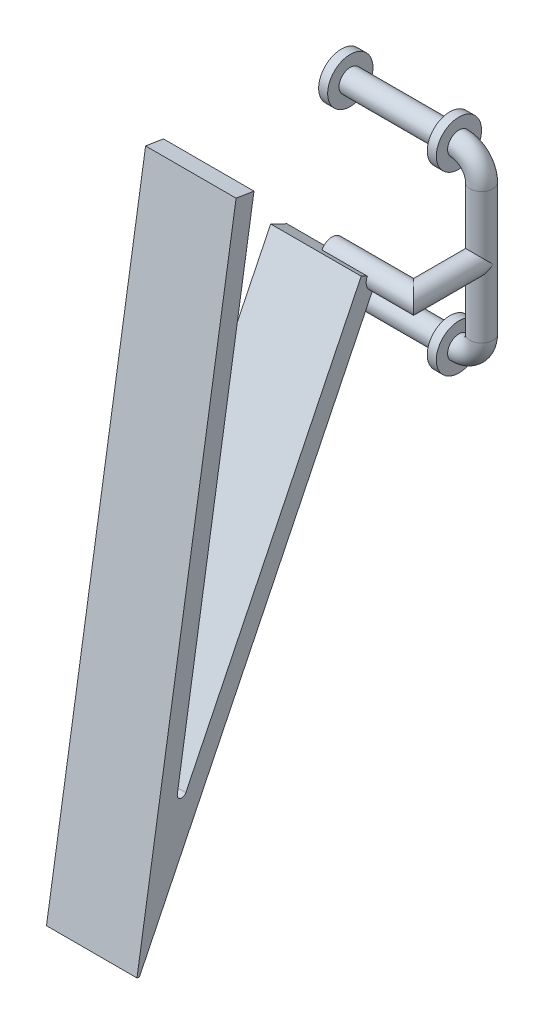
ISO-10303-21;
HEADER;
FILE_DESCRIPTION(('STEP AP214'),'2;1');
FILE_NAME('part.step','',(''),(''),'','','');
FILE_SCHEMA(('AUTOMOTIVE_DESIGN { 1 0 10303 214 1 1 1 1 }'));
ENDSEC;
DATA;
#1=APPLICATION_CONTEXT('core data for automotive mechanical design processes');
#2=APPLICATION_PROTOCOL_DEFINITION('international standard','automotive_design',2000,#1);
#3=PRODUCT_CONTEXT('',#1,'mechanical');
#4=PRODUCT('Part','Part','',(#3));
#5=PRODUCT_RELATED_PRODUCT_CATEGORY('part','',(#4));
#6=PRODUCT_DEFINITION_FORMATION('','',#4);
#7=PRODUCT_DEFINITION_CONTEXT('part definition',#1,'design');
#8=PRODUCT_DEFINITION('design','',#6,#7);
#9=PRODUCT_DEFINITION_SHAPE('','',#8);
#10=(LENGTH_UNIT() NAMED_UNIT(*) SI_UNIT(.MILLI.,.METRE.));
#11=(NAMED_UNIT(*) PLANE_ANGLE_UNIT() SI_UNIT($,.RADIAN.));
#12=(NAMED_UNIT(*) SI_UNIT($,.STERADIAN.) SOLID_ANGLE_UNIT());
#13=UNCERTAINTY_MEASURE_WITH_UNIT(LENGTH_MEASURE(1.E-05),#10,'distance_accuracy_value','');
#14=(GEOMETRIC_REPRESENTATION_CONTEXT(3) GLOBAL_UNCERTAINTY_ASSIGNED_CONTEXT((#13)) GLOBAL_UNIT_ASSIGNED_CONTEXT((#10,
#11,#12)) REPRESENTATION_CONTEXT('',''));
#15=CARTESIAN_POINT('',(0.,0.,0.));
#16=DIRECTION('',(0.,0.,1.));
#17=DIRECTION('',(1.,0.,0.));
#18=AXIS2_PLACEMENT_3D('',#15,#16,#17);
#19=CARTESIAN_POINT('',(31.,5.,0.));
#20=DIRECTION('',(0.,1.,0.));
#21=DIRECTION('',(-1.,0.,0.));
#22=AXIS2_PLACEMENT_3D('',#19,#20,#21);
#23=CYLINDRICAL_SURFACE('',#22,2.5);
#24=CARTESIAN_POINT('',(31.,34.,0.));
#25=DIRECTION('',(0.,1.,0.));
#26=DIRECTION('',(0.,0.,-1.));
#27=AXIS2_PLACEMENT_3D('',#24,#25,#26);
#28=CIRCLE('',#27,2.5);
#29=CARTESIAN_POINT('',(33.5,34.,0.));
#30=VERTEX_POINT('',#29);
#31=EDGE_CURVE('E232',#30,#30,#28,.T.);
#32=ORIENTED_EDGE('',*,*,#31,.F.);
#33=EDGE_LOOP('',(#32));
#34=FACE_BOUND('',#33,.T.);
#35=CARTESIAN_POINT('',(31.,5.,0.));
#36=DIRECTION('',(0.,1.,0.));
#37=DIRECTION('',(0.,0.,-1.));
#38=AXIS2_PLACEMENT_3D('',#35,#36,#37);
#39=CIRCLE('',#38,2.5);
#40=CARTESIAN_POINT('',(33.5,5.,0.));
#41=VERTEX_POINT('',#40);
#42=EDGE_CURVE('E229',#41,#41,#39,.T.);
#43=ORIENTED_EDGE('',*,*,#42,.T.);
#44=EDGE_LOOP('',(#43));
#45=FACE_BOUND('',#44,.T.);
#46=CARTESIAN_POINT('',(31.,19.5799362712137,0.));
#47=DIRECTION('',(0.,0.707106781186547,0.707106781186548));
#48=DIRECTION('',(0.,0.707106781186547,-0.707106781186548));
#49=AXIS2_PLACEMENT_3D('',#46,#47,#48);
#50=ELLIPSE('',#49,3.53553390593274,2.5);
#51=CARTESIAN_POINT('',(33.5,19.5799362712137,0.));
#52=VERTEX_POINT('',#51);
#53=CARTESIAN_POINT('',(28.5,19.5799362712137,0.));
#54=VERTEX_POINT('',#53);
#55=EDGE_CURVE('E246',#52,#54,#50,.F.);
#56=ORIENTED_EDGE('',*,*,#55,.T.);
#57=CARTESIAN_POINT('',(31.,19.5799362712137,0.));
#58=DIRECTION('',(0.,0.707106781186547,-0.707106781186548));
#59=DIRECTION('',(0.,0.707106781186547,0.707106781186548));
#60=AXIS2_PLACEMENT_3D('',#57,#58,#59);
#61=ELLIPSE('',#60,3.53553390593274,2.5);
#62=EDGE_CURVE('E56',#54,#52,#61,.T.);
#63=ORIENTED_EDGE('',*,*,#62,.T.);
#64=EDGE_LOOP('',(#56,#63));
#65=FACE_BOUND('',#64,.T.);
#66=ADVANCED_FACE('F34',(#34,#45,#65),#23,.T.);
#67=CARTESIAN_POINT('',(26.,34.,0.));
#68=DIRECTION('',(0.,0.,1.));
#69=DIRECTION('',(1.,0.,0.));
#70=AXIS2_PLACEMENT_3D('',#67,#68,#69);
#71=TOROIDAL_SURFACE('',#70,4.99999999999999,2.5);
#72=CARTESIAN_POINT('',(26.,39.,0.));
#73=DIRECTION('',(-1.,0.,0.));
#74=DIRECTION('',(0.,0.,-1.));
#75=AXIS2_PLACEMENT_3D('',#72,#73,#74);
#76=CIRCLE('',#75,2.5);
#77=CARTESIAN_POINT('',(26.,41.5,0.));
#78=VERTEX_POINT('',#77);
#79=EDGE_CURVE('E235',#78,#78,#76,.T.);
#80=CARTESIAN_POINT('',(26.,34.,0.));
#81=DIRECTION('',(0.,0.,1.));
#82=DIRECTION('',(1.,0.,0.));
#83=AXIS2_PLACEMENT_3D('',#80,#81,#82);
#84=CIRCLE('',#83,7.49999999999999);
#85=EDGE_CURVE('',#30,#78,#84,.T.);
#86=ORIENTED_EDGE('',*,*,#31,.T.);
#87=ORIENTED_EDGE('',*,*,#79,.F.);
#88=ORIENTED_EDGE('',*,*,#85,.T.);
#89=ORIENTED_EDGE('',*,*,#85,.F.);
#90=EDGE_LOOP('',(#86,#88,#87,#89));
#91=FACE_BOUND('',#90,.T.);
#92=ADVANCED_FACE('F273',(#91),#71,.T.);
#93=CARTESIAN_POINT('',(26.,5.,0.));
#94=DIRECTION('',(0.,0.,1.));
#95=DIRECTION('',(1.,0.,0.));
#96=AXIS2_PLACEMENT_3D('',#93,#94,#95);
#97=TOROIDAL_SURFACE('',#96,5.,2.5);
#98=CARTESIAN_POINT('',(26.,0.,0.));
#99=DIRECTION('',(1.,0.,0.));
#100=DIRECTION('',(0.,0.,-1.));
#101=AXIS2_PLACEMENT_3D('',#98,#99,#100);
#102=CIRCLE('',#101,2.5);
#103=CARTESIAN_POINT('',(26.,-2.5,0.));
#104=VERTEX_POINT('',#103);
#105=EDGE_CURVE('E210',#104,#104,#102,.T.);
#106=CARTESIAN_POINT('',(26.,5.,0.));
#107=DIRECTION('',(0.,0.,1.));
#108=DIRECTION('',(1.,0.,0.));
#109=AXIS2_PLACEMENT_3D('',#106,#107,#108);
#110=CIRCLE('',#109,7.5);
#111=EDGE_CURVE('',#104,#41,#110,.T.);
#112=ORIENTED_EDGE('',*,*,#105,.T.);
#113=ORIENTED_EDGE('',*,*,#42,.F.);
#114=ORIENTED_EDGE('',*,*,#111,.T.);
#115=ORIENTED_EDGE('',*,*,#111,.F.);
#116=EDGE_LOOP('',(#112,#114,#113,#115));
#117=FACE_BOUND('',#116,.T.);
#118=ADVANCED_FACE('F281',(#117),#97,.T.);
#119=CARTESIAN_POINT('',(24.,0.,0.));
#120=DIRECTION('',(1.,0.,0.));
#121=DIRECTION('',(0.,0.,-1.));
#122=AXIS2_PLACEMENT_3D('',#119,#120,#121);
#123=PLANE('',#122);
#124=CARTESIAN_POINT('',(24.,0.,0.));
#125=DIRECTION('',(1.,0.,0.));
#126=DIRECTION('',(0.,0.,-1.));
#127=AXIS2_PLACEMENT_3D('',#124,#125,#126);
#128=CIRCLE('',#127,5.);
#129=CARTESIAN_POINT('',(24.,0.,-5.));
#130=VERTEX_POINT('',#129);
#131=EDGE_CURVE('E207',#130,#130,#128,.T.);
#132=ORIENTED_EDGE('',*,*,#131,.F.);
#133=EDGE_LOOP('',(#132));
#134=FACE_BOUND('',#133,.T.);
#135=CARTESIAN_POINT('',(24.,0.,0.));
#136=DIRECTION('',(1.,0.,0.));
#137=DIRECTION('',(0.,0.,-1.));
#138=AXIS2_PLACEMENT_3D('',#135,#136,#137);
#139=CIRCLE('',#138,2.5);
#140=CARTESIAN_POINT('',(24.,0.,2.5));
#141=VERTEX_POINT('',#140);
#142=EDGE_CURVE('E243',#141,#141,#139,.T.);
#143=ORIENTED_EDGE('',*,*,#142,.T.);
#144=EDGE_LOOP('',(#143));
#145=FACE_BOUND('',#144,.T.);
#146=ADVANCED_FACE('F288',(#134,#145),#123,.F.);
#147=CARTESIAN_POINT('',(26.,0.,0.));
#148=DIRECTION('',(1.,0.,0.));
#149=DIRECTION('',(0.,0.,-1.));
#150=AXIS2_PLACEMENT_3D('',#147,#148,#149);
#151=PLANE('',#150);
#152=CARTESIAN_POINT('',(26.,0.,0.));
#153=DIRECTION('',(1.,0.,0.));
#154=DIRECTION('',(0.,0.,-1.));
#155=AXIS2_PLACEMENT_3D('',#152,#153,#154);
#156=CIRCLE('',#155,5.);
#157=CARTESIAN_POINT('',(26.,0.,-5.));
#158=VERTEX_POINT('',#157);
#159=EDGE_CURVE('E211',#158,#158,#156,.T.);
#160=ORIENTED_EDGE('',*,*,#159,.T.);
#161=EDGE_LOOP('',(#160));
#162=FACE_BOUND('',#161,.T.);
#163=ORIENTED_EDGE('',*,*,#105,.F.);
#164=EDGE_LOOP('',(#163));
#165=FACE_BOUND('',#164,.T.);
#166=ADVANCED_FACE('F323',(#162,#165),#151,.T.);
#167=CARTESIAN_POINT('',(24.,0.,0.));
#168=DIRECTION('',(1.,0.,0.));
#169=DIRECTION('',(0.,0.,-1.));
#170=AXIS2_PLACEMENT_3D('',#167,#168,#169);
#171=CYLINDRICAL_SURFACE('',#170,5.);
#172=ORIENTED_EDGE('',*,*,#131,.T.);
#173=EDGE_LOOP('',(#172));
#174=FACE_BOUND('',#173,.T.);
#175=ORIENTED_EDGE('',*,*,#159,.F.);
#176=EDGE_LOOP('',(#175));
#177=FACE_BOUND('',#176,.T.);
#178=ADVANCED_FACE('F300',(#174,#177),#171,.T.);
#179=CARTESIAN_POINT('',(0.,0.,0.));
#180=DIRECTION('',(1.,0.,0.));
#181=DIRECTION('',(0.,0.,-1.));
#182=AXIS2_PLACEMENT_3D('',#179,#180,#181);
#183=PLANE('',#182);
#184=CARTESIAN_POINT('',(0.,0.,0.));
#185=DIRECTION('',(1.,0.,0.));
#186=DIRECTION('',(0.,0.,-1.));
#187=AXIS2_PLACEMENT_3D('',#184,#185,#186);
#188=CIRCLE('',#187,5.);
#189=CARTESIAN_POINT('',(0.,0.,-5.));
#190=VERTEX_POINT('',#189);
#191=EDGE_CURVE('E220',#190,#190,#188,.T.);
#192=ORIENTED_EDGE('',*,*,#191,.F.);
#193=EDGE_LOOP('',(#192));
#194=FACE_BOUND('',#193,.T.);
#195=ADVANCED_FACE('F296',(#194),#183,.F.);
#196=CARTESIAN_POINT('',(2.,0.,0.));
#197=DIRECTION('',(-1.,0.,0.));
#198=DIRECTION('',(0.,0.,1.));
#199=AXIS2_PLACEMENT_3D('',#196,#197,#198);
#200=CYLINDRICAL_SURFACE('',#199,5.);
#201=CARTESIAN_POINT('',(2.,0.,0.));
#202=DIRECTION('',(1.,0.,0.));
#203=DIRECTION('',(0.,0.,-1.));
#204=AXIS2_PLACEMENT_3D('',#201,#202,#203);
#205=CIRCLE('',#204,5.);
#206=CARTESIAN_POINT('',(2.,0.,-5.));
#207=VERTEX_POINT('',#206);
#208=EDGE_CURVE('E223',#207,#207,#205,.T.);
#209=ORIENTED_EDGE('',*,*,#208,.F.);
#210=EDGE_LOOP('',(#209));
#211=FACE_BOUND('',#210,.T.);
#212=ORIENTED_EDGE('',*,*,#191,.T.);
#213=EDGE_LOOP('',(#212));
#214=FACE_BOUND('',#213,.T.);
#215=ADVANCED_FACE('F299',(#211,#214),#200,.T.);
#216=CARTESIAN_POINT('',(2.,0.,0.));
#217=DIRECTION('',(1.,0.,0.));
#218=DIRECTION('',(0.,0.,-1.));
#219=AXIS2_PLACEMENT_3D('',#216,#217,#218);
#220=PLANE('',#219);
#221=ORIENTED_EDGE('',*,*,#208,.T.);
#222=EDGE_LOOP('',(#221));
#223=FACE_BOUND('',#222,.T.);
#224=CARTESIAN_POINT('',(2.,0.,0.));
#225=DIRECTION('',(1.,0.,0.));
#226=DIRECTION('',(0.,0.,-1.));
#227=AXIS2_PLACEMENT_3D('',#224,#225,#226);
#228=CIRCLE('',#227,2.5);
#229=CARTESIAN_POINT('',(1.99999999999999,0.,2.5));
#230=VERTEX_POINT('',#229);
#231=EDGE_CURVE('E226',#230,#230,#228,.T.);
#232=ORIENTED_EDGE('',*,*,#231,.F.);
#233=EDGE_LOOP('',(#232));
#234=FACE_BOUND('',#233,.T.);
#235=ADVANCED_FACE('F294',(#223,#234),#220,.T.);
#236=CARTESIAN_POINT('',(26.,0.,0.));
#237=DIRECTION('',(-1.,0.,0.));
#238=DIRECTION('',(0.,0.,1.));
#239=AXIS2_PLACEMENT_3D('',#236,#237,#238);
#240=CYLINDRICAL_SURFACE('',#239,2.5);
#241=CARTESIAN_POINT('',(1.99999999999999,0.,2.5));
#242=CARTESIAN_POINT('',(2.22916666666666,0.,2.5));
#243=CARTESIAN_POINT('',(2.45833333333333,0.,2.5));
#244=CARTESIAN_POINT('',(2.91666666666666,0.,2.5));
#245=CARTESIAN_POINT('',(3.14583333333333,0.,2.5));
#246=CARTESIAN_POINT('',(3.60416666666666,0.,2.5));
#247=CARTESIAN_POINT('',(3.83333333333333,0.,2.5));
#248=CARTESIAN_POINT('',(4.29166666666666,0.,2.5));
#249=CARTESIAN_POINT('',(4.52083333333333,0.,2.5));
#250=CARTESIAN_POINT('',(4.97916666666666,0.,2.5));
#251=CARTESIAN_POINT('',(5.20833333333333,0.,2.5));
#252=CARTESIAN_POINT('',(5.66666666666666,0.,2.5));
#253=CARTESIAN_POINT('',(5.89583333333333,0.,2.5));
#254=CARTESIAN_POINT('',(6.35416666666666,0.,2.5));
#255=CARTESIAN_POINT('',(6.58333333333333,0.,2.5));
#256=CARTESIAN_POINT('',(7.04166666666666,0.,2.5));
#257=CARTESIAN_POINT('',(7.27083333333333,0.,2.5));
#258=CARTESIAN_POINT('',(7.72916666666666,0.,2.5));
#259=CARTESIAN_POINT('',(7.95833333333333,0.,2.5));
#260=CARTESIAN_POINT('',(8.41666666666666,0.,2.5));
#261=CARTESIAN_POINT('',(8.64583333333333,0.,2.5));
#262=CARTESIAN_POINT('',(9.10416666666666,0.,2.5));
#263=CARTESIAN_POINT('',(9.33333333333333,0.,2.5));
#264=CARTESIAN_POINT('',(9.79166666666666,0.,2.5));
#265=CARTESIAN_POINT('',(10.0208333333333,0.,2.5));
#266=CARTESIAN_POINT('',(10.4791666666667,0.,2.5));
#267=CARTESIAN_POINT('',(10.7083333333333,0.,2.5));
#268=CARTESIAN_POINT('',(11.1666666666667,0.,2.5));
#269=CARTESIAN_POINT('',(11.3958333333333,0.,2.5));
#270=CARTESIAN_POINT('',(11.8541666666667,0.,2.5));
#271=CARTESIAN_POINT('',(12.0833333333333,0.,2.5));
#272=CARTESIAN_POINT('',(12.5416666666667,0.,2.5));
#273=CARTESIAN_POINT('',(12.7708333333333,0.,2.5));
#274=CARTESIAN_POINT('',(13.2291666666667,0.,2.5));
#275=CARTESIAN_POINT('',(13.4583333333333,0.,2.5));
#276=CARTESIAN_POINT('',(13.9166666666667,0.,2.5));
#277=CARTESIAN_POINT('',(14.1458333333333,0.,2.5));
#278=CARTESIAN_POINT('',(14.6041666666667,0.,2.5));
#279=CARTESIAN_POINT('',(14.8333333333333,0.,2.5));
#280=CARTESIAN_POINT('',(15.2916666666667,0.,2.5));
#281=CARTESIAN_POINT('',(15.5208333333333,0.,2.5));
#282=CARTESIAN_POINT('',(15.9791666666667,0.,2.5));
#283=CARTESIAN_POINT('',(16.2083333333333,0.,2.5));
#284=CARTESIAN_POINT('',(16.6666666666667,0.,2.5));
#285=CARTESIAN_POINT('',(16.8958333333333,0.,2.5));
#286=CARTESIAN_POINT('',(17.3541666666667,0.,2.5));
#287=CARTESIAN_POINT('',(17.5833333333333,0.,2.5));
#288=CARTESIAN_POINT('',(18.0416666666667,0.,2.5));
#289=CARTESIAN_POINT('',(18.2708333333333,0.,2.5));
#290=CARTESIAN_POINT('',(18.7291666666667,0.,2.5));
#291=CARTESIAN_POINT('',(18.9583333333333,0.,2.5));
#292=CARTESIAN_POINT('',(19.4166666666667,0.,2.5));
#293=CARTESIAN_POINT('',(19.6458333333333,0.,2.5));
#294=CARTESIAN_POINT('',(20.1041666666667,0.,2.5));
#295=CARTESIAN_POINT('',(20.3333333333333,0.,2.5));
#296=CARTESIAN_POINT('',(20.7916666666667,0.,2.5));
#297=CARTESIAN_POINT('',(21.0208333333333,0.,2.5));
#298=CARTESIAN_POINT('',(21.4791666666667,0.,2.5));
#299=CARTESIAN_POINT('',(21.7083333333333,0.,2.5));
#300=CARTESIAN_POINT('',(22.1666666666667,0.,2.5));
#301=CARTESIAN_POINT('',(22.3958333333333,0.,2.5));
#302=CARTESIAN_POINT('',(22.8541666666667,0.,2.5));
#303=CARTESIAN_POINT('',(23.0833333333333,0.,2.5));
#304=CARTESIAN_POINT('',(23.5416666666667,0.,2.5));
#305=CARTESIAN_POINT('',(23.7708333333333,0.,2.5));
#306=CARTESIAN_POINT('',(24.,0.,2.5));
#307=B_SPLINE_CURVE_WITH_KNOTS('',3,(#241,#242,#243,#244,#245,#246,#247,#248,#249,#250,#251,
#252,#253,#254,#255,#256,#257,#258,#259,#260,#261,#262,#263,#264,#265,#266,#267,#268,#269,#270,
#271,#272,#273,#274,#275,#276,#277,#278,#279,#280,#281,#282,#283,#284,#285,#286,#287,#288,#289,
#290,#291,#292,#293,#294,#295,#296,#297,#298,#299,#300,#301,#302,#303,#304,#305,#306),
.UNSPECIFIED.,.F.,.F.,(4,2,2,2,2,2,2,2,2,2,2,2,2,2,2,2,2,2,2,2,2,2,2,2,2,2,2,2,2,2,2,2,4),(0.,
0.687500000000001,1.375,2.0625,2.75,3.4375,4.125,4.8125,5.5,6.1875,6.875,7.5625,8.25,8.9375,
9.625,10.3125,11.,11.6875,12.375,13.0625,13.75,14.4375,15.125,15.8125,16.5,17.1875,17.875,
18.5625,19.25,19.9375,20.625,21.3125,22.),.UNSPECIFIED.);
#308=EDGE_CURVE('BSEAM290',#230,#141,#307,.T.);
#309=ORIENTED_EDGE('',*,*,#231,.T.);
#310=ORIENTED_EDGE('',*,*,#142,.F.);
#311=ORIENTED_EDGE('',*,*,#308,.T.);
#312=ORIENTED_EDGE('',*,*,#308,.F.);
#313=EDGE_LOOP('',(#309,#311,#310,#312));
#314=FACE_BOUND('',#313,.T.);
#315=ADVANCED_FACE('F290',(#314),#240,.T.);
#316=CARTESIAN_POINT('',(24.,39.,0.));
#317=DIRECTION('',(1.,0.,0.));
#318=DIRECTION('',(0.,0.,-1.));
#319=AXIS2_PLACEMENT_3D('',#316,#317,#318);
#320=CYLINDRICAL_SURFACE('',#319,5.);
#321=CARTESIAN_POINT('',(24.,39.,0.));
#322=DIRECTION('',(1.,0.,0.));
#323=DIRECTION('',(0.,0.,-1.));
#324=AXIS2_PLACEMENT_3D('',#321,#322,#323);
#325=CIRCLE('',#324,5.);
#326=CARTESIAN_POINT('',(24.,39.,-5.));
#327=VERTEX_POINT('',#326);
#328=EDGE_CURVE('E201',#327,#327,#325,.T.);
#329=ORIENTED_EDGE('',*,*,#328,.T.);
#330=EDGE_LOOP('',(#329));
#331=FACE_BOUND('',#330,.T.);
#332=CARTESIAN_POINT('',(26.,39.,0.));
#333=DIRECTION('',(1.,0.,0.));
#334=DIRECTION('',(0.,0.,-1.));
#335=AXIS2_PLACEMENT_3D('',#332,#333,#334);
#336=CIRCLE('',#335,5.);
#337=CARTESIAN_POINT('',(26.,39.,-5.));
#338=VERTEX_POINT('',#337);
#339=EDGE_CURVE('E200',#338,#338,#336,.T.);
#340=ORIENTED_EDGE('',*,*,#339,.F.);
#341=EDGE_LOOP('',(#340));
#342=FACE_BOUND('',#341,.T.);
#343=ADVANCED_FACE('F293',(#331,#342),#320,.T.);
#344=CARTESIAN_POINT('',(24.,39.,0.));
#345=DIRECTION('',(1.,0.,0.));
#346=DIRECTION('',(0.,0.,-1.));
#347=AXIS2_PLACEMENT_3D('',#344,#345,#346);
#348=PLANE('',#347);
#349=CARTESIAN_POINT('',(24.,39.,0.));
#350=DIRECTION('',(1.,0.,0.));
#351=DIRECTION('',(0.,0.,-1.));
#352=AXIS2_PLACEMENT_3D('',#349,#350,#351);
#353=CIRCLE('',#352,2.5);
#354=CARTESIAN_POINT('',(24.,36.5,0.));
#355=VERTEX_POINT('',#354);
#356=EDGE_CURVE('E204',#355,#355,#353,.F.);
#357=ORIENTED_EDGE('',*,*,#356,.F.);
#358=EDGE_LOOP('',(#357));
#359=FACE_BOUND('',#358,.T.);
#360=ORIENTED_EDGE('',*,*,#328,.F.);
#361=EDGE_LOOP('',(#360));
#362=FACE_BOUND('',#361,.T.);
#363=ADVANCED_FACE('F333',(#359,#362),#348,.F.);
#364=CARTESIAN_POINT('',(26.,39.,0.));
#365=DIRECTION('',(1.,0.,0.));
#366=DIRECTION('',(0.,0.,-1.));
#367=AXIS2_PLACEMENT_3D('',#364,#365,#366);
#368=PLANE('',#367);
#369=ORIENTED_EDGE('',*,*,#79,.T.);
#370=EDGE_LOOP('',(#369));
#371=FACE_BOUND('',#370,.T.);
#372=ORIENTED_EDGE('',*,*,#339,.T.);
#373=EDGE_LOOP('',(#372));
#374=FACE_BOUND('',#373,.T.);
#375=ADVANCED_FACE('F306',(#371,#374),#368,.T.);
#376=CARTESIAN_POINT('',(0.,39.,0.));
#377=DIRECTION('',(-1.,0.,0.));
#378=DIRECTION('',(0.,0.,-1.));
#379=AXIS2_PLACEMENT_3D('',#376,#377,#378);
#380=PLANE('',#379);
#381=CARTESIAN_POINT('',(0.,39.,0.));
#382=DIRECTION('',(1.,0.,0.));
#383=DIRECTION('',(0.,0.,-1.));
#384=AXIS2_PLACEMENT_3D('',#381,#382,#383);
#385=CIRCLE('',#384,5.);
#386=CARTESIAN_POINT('',(0.,39.,-5.));
#387=VERTEX_POINT('',#386);
#388=EDGE_CURVE('E216',#387,#387,#385,.T.);
#389=ORIENTED_EDGE('',*,*,#388,.F.);
#390=EDGE_LOOP('',(#389));
#391=FACE_BOUND('',#390,.T.);
#392=ADVANCED_FACE('F302',(#391),#380,.T.);
#393=CARTESIAN_POINT('',(2.,39.,0.));
#394=DIRECTION('',(-1.,0.,0.));
#395=DIRECTION('',(0.,0.,1.));
#396=AXIS2_PLACEMENT_3D('',#393,#394,#395);
#397=CYLINDRICAL_SURFACE('',#396,5.);
#398=CARTESIAN_POINT('',(2.,39.,0.));
#399=DIRECTION('',(1.,0.,0.));
#400=DIRECTION('',(0.,0.,-1.));
#401=AXIS2_PLACEMENT_3D('',#398,#399,#400);
#402=CIRCLE('',#401,5.);
#403=CARTESIAN_POINT('',(2.,39.,-5.));
#404=VERTEX_POINT('',#403);
#405=EDGE_CURVE('E217',#404,#404,#402,.T.);
#406=ORIENTED_EDGE('',*,*,#405,.F.);
#407=EDGE_LOOP('',(#406));
#408=FACE_BOUND('',#407,.T.);
#409=ORIENTED_EDGE('',*,*,#388,.T.);
#410=EDGE_LOOP('',(#409));
#411=FACE_BOUND('',#410,.T.);
#412=ADVANCED_FACE('F305',(#408,#411),#397,.T.);
#413=CARTESIAN_POINT('',(2.,39.,0.));
#414=DIRECTION('',(1.,0.,0.));
#415=DIRECTION('',(0.,0.,-1.));
#416=AXIS2_PLACEMENT_3D('',#413,#414,#415);
#417=PLANE('',#416);
#418=CARTESIAN_POINT('',(2.,39.,0.));
#419=DIRECTION('',(1.,0.,0.));
#420=DIRECTION('',(0.,0.,-1.));
#421=AXIS2_PLACEMENT_3D('',#418,#419,#420);
#422=CIRCLE('',#421,2.5);
#423=CARTESIAN_POINT('',(2.,36.5,0.));
#424=VERTEX_POINT('',#423);
#425=EDGE_CURVE('E238',#424,#424,#422,.F.);
#426=ORIENTED_EDGE('',*,*,#425,.T.);
#427=EDGE_LOOP('',(#426));
#428=FACE_BOUND('',#427,.T.);
#429=ORIENTED_EDGE('',*,*,#405,.T.);
#430=EDGE_LOOP('',(#429));
#431=FACE_BOUND('',#430,.T.);
#432=ADVANCED_FACE('F316',(#428,#431),#417,.T.);
#433=CARTESIAN_POINT('',(26.,39.,0.));
#434=DIRECTION('',(-1.,0.,0.));
#435=DIRECTION('',(0.,-1.,0.));
#436=AXIS2_PLACEMENT_3D('',#433,#434,#435);
#437=CYLINDRICAL_SURFACE('',#436,2.5);
#438=CARTESIAN_POINT('',(2.,36.5,0.));
#439=CARTESIAN_POINT('',(2.22916666666667,36.5,0.));
#440=CARTESIAN_POINT('',(2.45833333333333,36.5,0.));
#441=CARTESIAN_POINT('',(2.91666666666667,36.5,0.));
#442=CARTESIAN_POINT('',(3.14583333333333,36.5,0.));
#443=CARTESIAN_POINT('',(3.60416666666667,36.5,0.));
#444=CARTESIAN_POINT('',(3.83333333333333,36.5,0.));
#445=CARTESIAN_POINT('',(4.29166666666666,36.5,0.));
#446=CARTESIAN_POINT('',(4.52083333333333,36.5,0.));
#447=CARTESIAN_POINT('',(4.97916666666666,36.5,0.));
#448=CARTESIAN_POINT('',(5.20833333333333,36.5,0.));
#449=CARTESIAN_POINT('',(5.66666666666666,36.5,0.));
#450=CARTESIAN_POINT('',(5.89583333333333,36.5,0.));
#451=CARTESIAN_POINT('',(6.35416666666666,36.5,0.));
#452=CARTESIAN_POINT('',(6.58333333333333,36.5,0.));
#453=CARTESIAN_POINT('',(7.04166666666666,36.5,0.));
#454=CARTESIAN_POINT('',(7.27083333333333,36.5,0.));
#455=CARTESIAN_POINT('',(7.72916666666666,36.5,0.));
#456=CARTESIAN_POINT('',(7.95833333333333,36.5,0.));
#457=CARTESIAN_POINT('',(8.41666666666666,36.5,0.));
#458=CARTESIAN_POINT('',(8.64583333333333,36.5,0.));
#459=CARTESIAN_POINT('',(9.10416666666666,36.5,0.));
#460=CARTESIAN_POINT('',(9.33333333333333,36.5,0.));
#461=CARTESIAN_POINT('',(9.79166666666667,36.5,0.));
#462=CARTESIAN_POINT('',(10.0208333333333,36.5,0.));
#463=CARTESIAN_POINT('',(10.4791666666667,36.5,0.));
#464=CARTESIAN_POINT('',(10.7083333333333,36.5,0.));
#465=CARTESIAN_POINT('',(11.1666666666667,36.5,0.));
#466=CARTESIAN_POINT('',(11.3958333333333,36.5,0.));
#467=CARTESIAN_POINT('',(11.8541666666667,36.5,0.));
#468=CARTESIAN_POINT('',(12.0833333333333,36.5,0.));
#469=CARTESIAN_POINT('',(12.5416666666667,36.5,0.));
#470=CARTESIAN_POINT('',(12.7708333333333,36.5,0.));
#471=CARTESIAN_POINT('',(13.2291666666667,36.5,0.));
#472=CARTESIAN_POINT('',(13.4583333333333,36.5,0.));
#473=CARTESIAN_POINT('',(13.9166666666667,36.5,0.));
#474=CARTESIAN_POINT('',(14.1458333333333,36.5,0.));
#475=CARTESIAN_POINT('',(14.6041666666667,36.5,0.));
#476=CARTESIAN_POINT('',(14.8333333333333,36.5,0.));
#477=CARTESIAN_POINT('',(15.2916666666667,36.5,0.));
#478=CARTESIAN_POINT('',(15.5208333333333,36.5,0.));
#479=CARTESIAN_POINT('',(15.9791666666667,36.5,0.));
#480=CARTESIAN_POINT('',(16.2083333333333,36.5,0.));
#481=CARTESIAN_POINT('',(16.6666666666667,36.5,0.));
#482=CARTESIAN_POINT('',(16.8958333333333,36.5,0.));
#483=CARTESIAN_POINT('',(17.3541666666667,36.5,0.));
#484=CARTESIAN_POINT('',(17.5833333333333,36.5,0.));
#485=CARTESIAN_POINT('',(18.0416666666667,36.5,0.));
#486=CARTESIAN_POINT('',(18.2708333333333,36.5,0.));
#487=CARTESIAN_POINT('',(18.7291666666667,36.5,0.));
#488=CARTESIAN_POINT('',(18.9583333333333,36.5,0.));
#489=CARTESIAN_POINT('',(19.4166666666667,36.5,0.));
#490=CARTESIAN_POINT('',(19.6458333333333,36.5,0.));
#491=CARTESIAN_POINT('',(20.1041666666667,36.5,0.));
#492=CARTESIAN_POINT('',(20.3333333333333,36.5,0.));
#493=CARTESIAN_POINT('',(20.7916666666667,36.5,0.));
#494=CARTESIAN_POINT('',(21.0208333333333,36.5,0.));
#495=CARTESIAN_POINT('',(21.4791666666667,36.5,0.));
#496=CARTESIAN_POINT('',(21.7083333333333,36.5,0.));
#497=CARTESIAN_POINT('',(22.1666666666667,36.5,0.));
#498=CARTESIAN_POINT('',(22.3958333333333,36.5,0.));
#499=CARTESIAN_POINT('',(22.8541666666667,36.5,0.));
#500=CARTESIAN_POINT('',(23.0833333333333,36.5,0.));
#501=CARTESIAN_POINT('',(23.5416666666667,36.5,0.));
#502=CARTESIAN_POINT('',(23.7708333333333,36.5,0.));
#503=CARTESIAN_POINT('',(24.,36.5,0.));
#504=B_SPLINE_CURVE_WITH_KNOTS('',3,(#438,#439,#440,#441,#442,#443,#444,#445,#446,#447,#448,
#449,#450,#451,#452,#453,#454,#455,#456,#457,#458,#459,#460,#461,#462,#463,#464,#465,#466,#467,
#468,#469,#470,#471,#472,#473,#474,#475,#476,#477,#478,#479,#480,#481,#482,#483,#484,#485,#486,
#487,#488,#489,#490,#491,#492,#493,#494,#495,#496,#497,#498,#499,#500,#501,#502,#503),
.UNSPECIFIED.,.F.,.F.,(4,2,2,2,2,2,2,2,2,2,2,2,2,2,2,2,2,2,2,2,2,2,2,2,2,2,2,2,2,2,2,2,4),(0.,
0.687500000000001,1.375,2.0625,2.75,3.4375,4.125,4.8125,5.5,6.1875,6.875,7.5625,8.25,8.9375,
9.625,10.3125,11.,11.6875,12.375,13.0625,13.75,14.4375,15.125,15.8125,16.5,17.1875,17.875,
18.5625,19.25,19.9375,20.625,21.3125,22.),.UNSPECIFIED.);
#505=EDGE_CURVE('BSEAM36',#424,#355,#504,.T.);
#506=ORIENTED_EDGE('',*,*,#425,.F.);
#507=ORIENTED_EDGE('',*,*,#356,.T.);
#508=ORIENTED_EDGE('',*,*,#505,.T.);
#509=ORIENTED_EDGE('',*,*,#505,.F.);
#510=EDGE_LOOP('',(#506,#508,#507,#509));
#511=FACE_BOUND('',#510,.T.);
#512=ADVANCED_FACE('F36',(#511),#437,.T.);
#513=CARTESIAN_POINT('',(31.,19.5799362712137,15.));
#514=DIRECTION('',(0.,0.,-1.));
#515=DIRECTION('',(-1.,0.,0.));
#516=AXIS2_PLACEMENT_3D('',#513,#514,#515);
#517=CYLINDRICAL_SURFACE('',#516,2.5);
#518=ORIENTED_EDGE('',*,*,#62,.F.);
#519=ORIENTED_EDGE('',*,*,#55,.F.);
#520=EDGE_LOOP('',(#518,#519));
#521=FACE_BOUND('',#520,.T.);
#522=CARTESIAN_POINT('',(31.,19.5799362712137,15.));
#523=DIRECTION('',(0.707106781186547,0.,-0.707106781186548));
#524=DIRECTION('',(-0.707106781186548,0.,-0.707106781186547));
#525=AXIS2_PLACEMENT_3D('',#522,#523,#524);
#526=ELLIPSE('',#525,3.53553390593274,2.5);
#527=CARTESIAN_POINT('',(28.5,19.5799362712137,12.5));
#528=VERTEX_POINT('',#527);
#529=EDGE_CURVE('E197',#528,#528,#526,.F.);
#530=ORIENTED_EDGE('',*,*,#529,.F.);
#531=EDGE_LOOP('',(#530));
#532=FACE_BOUND('',#531,.T.);
#533=ADVANCED_FACE('F263',(#521,#532),#517,.T.);
#534=CARTESIAN_POINT('',(13.,19.5799362712137,15.));
#535=DIRECTION('',(-1.,0.,0.));
#536=DIRECTION('',(0.,-1.,0.));
#537=AXIS2_PLACEMENT_3D('',#534,#535,#536);
#538=PLANE('',#537);
#539=DIRECTION('',(0.,-0.438371146789072,-0.89879404629917));
#540=VECTOR('',#539,1.);
#541=CARTESIAN_POINT('',(13.,19.5799362712137,15.));
#542=LINE('',#541,#540);
#543=CARTESIAN_POINT('',(13.,20.6758641381864,17.2469851157479));
#544=VERTEX_POINT('',#543);
#545=CARTESIAN_POINT('',(13.,19.5799362712137,15.));
#546=VERTEX_POINT('',#545);
#547=EDGE_CURVE('E192',#544,#546,#542,.T.);
#548=ORIENTED_EDGE('',*,*,#547,.F.);
#549=CARTESIAN_POINT('',(13.,19.5799362712137,15.));
#550=DIRECTION('',(-1.,0.,0.));
#551=DIRECTION('',(0.,-1.,0.));
#552=AXIS2_PLACEMENT_3D('',#549,#550,#551);
#553=CIRCLE('',#552,2.5);
#554=CARTESIAN_POINT('',(13.,17.3329511554658,16.0959278669727));
#555=VERTEX_POINT('',#554);
#556=EDGE_CURVE('E194',#544,#555,#553,.T.);
#557=ORIENTED_EDGE('',*,*,#556,.T.);
#558=DIRECTION('',(0.,-0.898794046299169,0.438371146789073));
#559=VECTOR('',#558,1.);
#560=CARTESIAN_POINT('',(13.,19.5799362712137,15.));
#561=LINE('',#560,#559);
#562=EDGE_CURVE('E179',#546,#555,#561,.T.);
#563=ORIENTED_EDGE('',*,*,#562,.F.);
#564=EDGE_LOOP('',(#548,#557,#563));
#565=FACE_BOUND('',#564,.T.);
#566=ADVANCED_FACE('F261',(#565),#538,.T.);
#567=CARTESIAN_POINT('',(38.0710678118655,19.5799362712137,15.));
#568=DIRECTION('',(-1.,0.,0.));
#569=DIRECTION('',(0.,0.,1.));
#570=AXIS2_PLACEMENT_3D('',#567,#568,#569);
#571=CYLINDRICAL_SURFACE('',#570,2.5);
#572=DIRECTION('',(-1.,0.,0.));
#573=VECTOR('',#572,1.);
#574=CARTESIAN_POINT('',(38.0710678118655,20.6758641381864,17.2469851157479));
#575=LINE('',#574,#573);
#576=CARTESIAN_POINT('',(23.,20.6758641381864,17.2469851157479));
#577=VERTEX_POINT('',#576);
#578=EDGE_CURVE('E12',#577,#544,#575,.T.);
#579=ORIENTED_EDGE('',*,*,#578,.F.);
#580=CARTESIAN_POINT('',(23.,19.5799362712137,15.));
#581=DIRECTION('',(-1.,0.,0.));
#582=DIRECTION('',(0.,-1.,0.));
#583=AXIS2_PLACEMENT_3D('',#580,#581,#582);
#584=CIRCLE('',#583,2.5);
#585=CARTESIAN_POINT('',(23.,17.3329511554658,16.0959278669727));
#586=VERTEX_POINT('',#585);
#587=EDGE_CURVE('E124',#577,#586,#584,.F.);
#588=ORIENTED_EDGE('',*,*,#587,.T.);
#589=DIRECTION('',(-1.,0.,0.));
#590=VECTOR('',#589,1.);
#591=CARTESIAN_POINT('',(38.0710678118655,17.3329511554658,16.0959278669727));
#592=LINE('',#591,#590);
#593=EDGE_CURVE('E42',#555,#586,#592,.F.);
#594=ORIENTED_EDGE('',*,*,#593,.F.);
#595=ORIENTED_EDGE('',*,*,#556,.F.);
#596=EDGE_LOOP('',(#579,#588,#594,#595));
#597=FACE_BOUND('',#596,.T.);
#598=ORIENTED_EDGE('',*,*,#529,.T.);
#599=EDGE_LOOP('',(#598));
#600=FACE_BOUND('',#599,.T.);
#601=ADVANCED_FACE('F257',(#597,#600),#571,.T.);
#602=CARTESIAN_POINT('',(2.99999999999995,19.5799362712137,15.));
#603=DIRECTION('',(0.,0.89879404629917,-0.438371146789072));
#604=DIRECTION('',(0.,0.438371146789072,0.89879404629917));
#605=AXIS2_PLACEMENT_3D('',#602,#603,#604);
#606=PLANE('',#605);
#607=ORIENTED_EDGE('',*,*,#578,.T.);
#608=ORIENTED_EDGE('',*,*,#547,.T.);
#609=DIRECTION('',(1.,0.,0.));
#610=VECTOR('',#609,1.);
#611=CARTESIAN_POINT('',(2.99999999999995,19.5799362712137,15.));
#612=LINE('',#611,#610);
#613=CARTESIAN_POINT('',(2.99999999999995,19.5799362712137,15.));
#614=VERTEX_POINT('',#613);
#615=EDGE_CURVE('E176',#614,#546,#612,.T.);
#616=ORIENTED_EDGE('',*,*,#615,.F.);
#617=DIRECTION('',(0.,0.438371146789071,0.89879404629917));
#618=VECTOR('',#617,1.);
#619=CARTESIAN_POINT('',(2.99999999999995,19.5799362712137,15.));
#620=LINE('',#619,#618);
#621=CARTESIAN_POINT('',(2.99999999999995,21.3334208583699,18.5951761851966));
#622=VERTEX_POINT('',#621);
#623=EDGE_CURVE('E132',#614,#622,#620,.T.);
#624=ORIENTED_EDGE('',*,*,#623,.T.);
#625=DIRECTION('',(1.,0.,0.));
#626=VECTOR('',#625,1.);
#627=CARTESIAN_POINT('',(2.99999999999995,21.3334208583699,18.5951761851966));
#628=LINE('',#627,#626);
#629=CARTESIAN_POINT('',(23.,21.3334208583699,18.5951761851966));
#630=VERTEX_POINT('',#629);
#631=EDGE_CURVE('E129',#622,#630,#628,.T.);
#632=ORIENTED_EDGE('',*,*,#631,.T.);
#633=DIRECTION('',(0.,0.438371146789071,0.89879404629917));
#634=VECTOR('',#633,1.);
#635=CARTESIAN_POINT('',(23.,19.5799362712137,15.));
#636=LINE('',#635,#634);
#637=EDGE_CURVE('E116',#577,#630,#636,.T.);
#638=ORIENTED_EDGE('',*,*,#637,.F.);
#639=EDGE_LOOP('',(#607,#608,#616,#624,#632,#638));
#640=FACE_BOUND('',#639,.T.);
#641=ADVANCED_FACE('F130',(#640),#606,.T.);
#642=CARTESIAN_POINT('',(2.99999999999999,-88.2753492846864,67.6045376146887));
#643=DIRECTION('',(0.,-0.438371146789073,-0.898794046299169));
#644=DIRECTION('',(0.,0.898794046299169,-0.438371146789073));
#645=AXIS2_PLACEMENT_3D('',#642,#643,#644);
#646=PLANE('',#645);
#647=ORIENTED_EDGE('',*,*,#615,.T.);
#648=ORIENTED_EDGE('',*,*,#562,.T.);
#649=ORIENTED_EDGE('',*,*,#593,.T.);
#650=DIRECTION('',(0.,0.898794046299169,-0.438371146789073));
#651=VECTOR('',#650,1.);
#652=CARTESIAN_POINT('',(23.,-88.2753492846864,67.6045376146887));
#653=LINE('',#652,#651);
#654=CARTESIAN_POINT('',(23.,-88.2753492846864,67.6045376146887));
#655=VERTEX_POINT('',#654);
#656=EDGE_CURVE('E49',#655,#586,#653,.T.);
#657=ORIENTED_EDGE('',*,*,#656,.F.);
#658=DIRECTION('',(1.,0.,0.));
#659=VECTOR('',#658,1.);
#660=CARTESIAN_POINT('',(2.99999999999999,-88.2753492846864,67.6045376146887));
#661=LINE('',#660,#659);
#662=CARTESIAN_POINT('',(2.99999999999999,-88.2753492846864,67.6045376146887));
#663=VERTEX_POINT('',#662);
#664=EDGE_CURVE('E180',#663,#655,#661,.T.);
#665=ORIENTED_EDGE('',*,*,#664,.F.);
#666=DIRECTION('',(0.,0.898794046299169,-0.438371146789073));
#667=VECTOR('',#666,1.);
#668=CARTESIAN_POINT('',(2.99999999999999,-88.2753492846864,67.6045376146887));
#669=LINE('',#668,#667);
#670=EDGE_CURVE('E137',#663,#614,#669,.T.);
#671=ORIENTED_EDGE('',*,*,#670,.T.);
#672=EDGE_LOOP('',(#647,#648,#649,#657,#665,#671));
#673=FACE_BOUND('',#672,.T.);
#674=ADVANCED_FACE('F253',(#673),#646,.T.);
#675=CARTESIAN_POINT('',(2.99999999999999,-88.1909528924426,68.1373954640515));
#676=DIRECTION('',(0.,-0.987688340595148,0.156434465040168));
#677=DIRECTION('',(0.,-0.156434465040168,-0.987688340595148));
#678=AXIS2_PLACEMENT_3D('',#675,#676,#677);
#679=PLANE('',#678);
#680=ORIENTED_EDGE('',*,*,#664,.T.);
#681=DIRECTION('',(0.,-0.156434465040168,-0.987688340595148));
#682=VECTOR('',#681,1.);
#683=CARTESIAN_POINT('',(23.,-88.1909528924426,68.1373954640515));
#684=LINE('',#683,#682);
#685=CARTESIAN_POINT('',(23.,-88.1909528924426,68.1373954640515));
#686=VERTEX_POINT('',#685);
#687=EDGE_CURVE('E153',#686,#655,#684,.T.);
#688=ORIENTED_EDGE('',*,*,#687,.F.);
#689=DIRECTION('',(1.,0.,0.));
#690=VECTOR('',#689,1.);
#691=CARTESIAN_POINT('',(2.99999999999999,-88.1909528924426,68.1373954640515));
#692=LINE('',#691,#690);
#693=CARTESIAN_POINT('',(2.99999999999999,-88.1909528924426,68.1373954640515));
#694=VERTEX_POINT('',#693);
#695=EDGE_CURVE('E182',#694,#686,#692,.T.);
#696=ORIENTED_EDGE('',*,*,#695,.F.);
#697=DIRECTION('',(0.,-0.156434465040168,-0.987688340595148));
#698=VECTOR('',#697,1.);
#699=CARTESIAN_POINT('',(2.99999999999999,-88.1909528924426,68.1373954640515));
#700=LINE('',#699,#698);
#701=EDGE_CURVE('E171',#694,#663,#700,.T.);
#702=ORIENTED_EDGE('',*,*,#701,.T.);
#703=EDGE_LOOP('',(#680,#688,#696,#702));
#704=FACE_BOUND('',#703,.T.);
#705=ADVANCED_FACE('F394',(#704),#679,.T.);
#706=CARTESIAN_POINT('',(2.99999999999995,50.0854147908766,46.2365703584188));
#707=DIRECTION('',(0.,0.156434465040233,0.987688340595137));
#708=DIRECTION('',(0.,-0.987688340595137,0.156434465040233));
#709=AXIS2_PLACEMENT_3D('',#706,#707,#708);
#710=PLANE('',#709);
#711=ORIENTED_EDGE('',*,*,#695,.T.);
#712=DIRECTION('',(0.,-0.987688340595137,0.156434465040233));
#713=VECTOR('',#712,1.);
#714=CARTESIAN_POINT('',(23.,50.0854147908766,46.2365703584188));
#715=LINE('',#714,#713);
#716=CARTESIAN_POINT('',(23.,50.0854147908766,46.2365703584188));
#717=VERTEX_POINT('',#716);
#718=EDGE_CURVE('E150',#717,#686,#715,.T.);
#719=ORIENTED_EDGE('',*,*,#718,.F.);
#720=DIRECTION('',(1.,0.,0.));
#721=VECTOR('',#720,1.);
#722=CARTESIAN_POINT('',(2.99999999999995,50.0854147908766,46.2365703584188));
#723=LINE('',#722,#721);
#724=CARTESIAN_POINT('',(2.99999999999995,50.0854147908766,46.2365703584188));
#725=VERTEX_POINT('',#724);
#726=EDGE_CURVE('E184',#725,#717,#723,.T.);
#727=ORIENTED_EDGE('',*,*,#726,.F.);
#728=DIRECTION('',(0.,-0.987688340595137,0.156434465040233));
#729=VECTOR('',#728,1.);
#730=CARTESIAN_POINT('',(2.99999999999995,50.0854147908766,46.2365703584188));
#731=LINE('',#730,#729);
#732=EDGE_CURVE('E168',#725,#694,#731,.T.);
#733=ORIENTED_EDGE('',*,*,#732,.T.);
#734=EDGE_LOOP('',(#711,#719,#727,#733));
#735=FACE_BOUND('',#734,.T.);
#736=ADVANCED_FACE('F403',(#735),#710,.T.);
#737=CARTESIAN_POINT('',(2.99999999999995,49.4596769307157,42.2858169960383));
#738=DIRECTION('',(0.,0.987688340595138,-0.156434465040225));
#739=DIRECTION('',(0.,0.156434465040225,0.987688340595139));
#740=AXIS2_PLACEMENT_3D('',#737,#738,#739);
#741=PLANE('',#740);
#742=ORIENTED_EDGE('',*,*,#726,.T.);
#743=DIRECTION('',(0.,0.156434465040225,0.987688340595138));
#744=VECTOR('',#743,1.);
#745=CARTESIAN_POINT('',(22.9999999999999,49.4596769307157,42.2858169960383));
#746=LINE('',#745,#744);
#747=CARTESIAN_POINT('',(22.9999999999999,49.4596769307157,42.2858169960383));
#748=VERTEX_POINT('',#747);
#749=EDGE_CURVE('E147',#748,#717,#746,.T.);
#750=ORIENTED_EDGE('',*,*,#749,.F.);
#751=DIRECTION('',(1.,0.,0.));
#752=VECTOR('',#751,1.);
#753=CARTESIAN_POINT('',(2.99999999999995,49.4596769307157,42.2858169960383));
#754=LINE('',#753,#752);
#755=CARTESIAN_POINT('',(2.99999999999995,49.4596769307157,42.2858169960383));
#756=VERTEX_POINT('',#755);
#757=EDGE_CURVE('E186',#756,#748,#754,.T.);
#758=ORIENTED_EDGE('',*,*,#757,.F.);
#759=DIRECTION('',(0.,0.156434465040225,0.987688340595138));
#760=VECTOR('',#759,1.);
#761=CARTESIAN_POINT('',(2.99999999999995,49.4596769307157,42.2858169960383));
#762=LINE('',#761,#760);
#763=EDGE_CURVE('E165',#756,#725,#762,.T.);
#764=ORIENTED_EDGE('',*,*,#763,.T.);
#765=EDGE_LOOP('',(#742,#750,#758,#764));
#766=FACE_BOUND('',#765,.T.);
#767=ADVANCED_FACE('F413',(#766),#741,.T.);
#768=CARTESIAN_POINT('',(2.99999999999998,-57.5157052360377,59.2290530290229));
#769=DIRECTION('',(0.,-0.156434465040231,-0.987688340595138));
#770=DIRECTION('',(0.,0.987688340595138,-0.156434465040231));
#771=AXIS2_PLACEMENT_3D('',#768,#769,#770);
#772=PLANE('',#771);
#773=ORIENTED_EDGE('',*,*,#757,.T.);
#774=DIRECTION('',(0.,0.987688340595138,-0.156434465040231));
#775=VECTOR('',#774,1.);
#776=CARTESIAN_POINT('',(23.,-57.5157052360377,59.2290530290229));
#777=LINE('',#776,#775);
#778=CARTESIAN_POINT('',(23.,-57.5157052360377,59.2290530290229));
#779=VERTEX_POINT('',#778);
#780=EDGE_CURVE('E142',#779,#748,#777,.T.);
#781=ORIENTED_EDGE('',*,*,#780,.F.);
#782=DIRECTION('',(1.,0.,0.));
#783=VECTOR('',#782,1.);
#784=CARTESIAN_POINT('',(2.99999999999998,-57.5157052360377,59.2290530290229));
#785=LINE('',#784,#783);
#786=CARTESIAN_POINT('',(2.99999999999998,-57.5157052360377,59.2290530290229));
#787=VERTEX_POINT('',#786);
#788=EDGE_CURVE('E188',#787,#779,#785,.T.);
#789=ORIENTED_EDGE('',*,*,#788,.F.);
#790=DIRECTION('',(0.,0.987688340595138,-0.156434465040231));
#791=VECTOR('',#790,1.);
#792=CARTESIAN_POINT('',(2.99999999999998,-57.5157052360377,59.2290530290229));
#793=LINE('',#792,#791);
#794=EDGE_CURVE('E162',#787,#756,#793,.T.);
#795=ORIENTED_EDGE('',*,*,#794,.T.);
#796=EDGE_LOOP('',(#773,#781,#789,#795));
#797=FACE_BOUND('',#796,.T.);
#798=ADVANCED_FACE('F423',(#797),#772,.T.);
#799=CARTESIAN_POINT('',(2.99999999999998,-57.6721397010782,58.2413646884278));
#800=DIRECTION('',(1.,0.,0.));
#801=DIRECTION('',(0.,1.,0.));
#802=AXIS2_PLACEMENT_3D('',#799,#800,#801);
#803=CYLINDRICAL_SURFACE('',#802,0.999999999999962);
#804=ORIENTED_EDGE('',*,*,#788,.T.);
#805=CARTESIAN_POINT('',(23.,-57.6721397010782,58.2413646884278));
#806=DIRECTION('',(-1.,0.,0.));
#807=DIRECTION('',(0.,-1.,0.));
#808=AXIS2_PLACEMENT_3D('',#805,#806,#807);
#809=CIRCLE('',#808,0.999999999999962);
#810=CARTESIAN_POINT('',(23.,-58.110510847867,57.3425706421286));
#811=VERTEX_POINT('',#810);
#812=EDGE_CURVE('E140',#811,#779,#809,.T.);
#813=ORIENTED_EDGE('',*,*,#812,.F.);
#814=DIRECTION('',(1.,0.,0.));
#815=VECTOR('',#814,1.);
#816=CARTESIAN_POINT('',(2.99999999999998,-58.110510847867,57.3425706421286));
#817=LINE('',#816,#815);
#818=CARTESIAN_POINT('',(2.99999999999998,-58.110510847867,57.3425706421286));
#819=VERTEX_POINT('',#818);
#820=EDGE_CURVE('E136',#819,#811,#817,.T.);
#821=ORIENTED_EDGE('',*,*,#820,.F.);
#822=CARTESIAN_POINT('',(2.99999999999998,-57.6721397010782,58.2413646884278));
#823=DIRECTION('',(-1.,0.,0.));
#824=DIRECTION('',(0.,-1.,0.));
#825=AXIS2_PLACEMENT_3D('',#822,#823,#824);
#826=CIRCLE('',#825,0.999999999999962);
#827=EDGE_CURVE('E159',#819,#787,#826,.T.);
#828=ORIENTED_EDGE('',*,*,#827,.T.);
#829=EDGE_LOOP('',(#804,#813,#821,#828));
#830=FACE_BOUND('',#829,.T.);
#831=ADVANCED_FACE('F433',(#830),#803,.F.);
#832=CARTESIAN_POINT('',(2.99999999999995,21.3334208583699,18.5951761851966));
#833=DIRECTION('',(0.,0.438371146789074,0.898794046299169));
#834=DIRECTION('',(0.,-0.898794046299169,0.438371146789074));
#835=AXIS2_PLACEMENT_3D('',#832,#833,#834);
#836=PLANE('',#835);
#837=ORIENTED_EDGE('',*,*,#820,.T.);
#838=DIRECTION('',(0.,-0.898794046299169,0.438371146789074));
#839=VECTOR('',#838,1.);
#840=CARTESIAN_POINT('',(23.,21.3334208583699,18.5951761851966));
#841=LINE('',#840,#839);
#842=EDGE_CURVE('E121',#630,#811,#841,.T.);
#843=ORIENTED_EDGE('',*,*,#842,.F.);
#844=ORIENTED_EDGE('',*,*,#631,.F.);
#845=DIRECTION('',(0.,-0.898794046299169,0.438371146789074));
#846=VECTOR('',#845,1.);
#847=CARTESIAN_POINT('',(2.99999999999995,21.3334208583699,18.5951761851966));
#848=LINE('',#847,#846);
#849=EDGE_CURVE('E157',#622,#819,#848,.T.);
#850=ORIENTED_EDGE('',*,*,#849,.T.);
#851=EDGE_LOOP('',(#837,#843,#844,#850));
#852=FACE_BOUND('',#851,.T.);
#853=ADVANCED_FACE('F139',(#852),#836,.T.);
#854=CARTESIAN_POINT('',(2.99999999999998,-57.6721397010782,58.2413646884278));
#855=DIRECTION('',(-1.,0.,0.));
#856=DIRECTION('',(0.,-1.,0.));
#857=AXIS2_PLACEMENT_3D('',#854,#855,#856);
#858=PLANE('',#857);
#859=ORIENTED_EDGE('',*,*,#623,.F.);
#860=ORIENTED_EDGE('',*,*,#670,.F.);
#861=ORIENTED_EDGE('',*,*,#701,.F.);
#862=ORIENTED_EDGE('',*,*,#732,.F.);
#863=ORIENTED_EDGE('',*,*,#763,.F.);
#864=ORIENTED_EDGE('',*,*,#794,.F.);
#865=ORIENTED_EDGE('',*,*,#827,.F.);
#866=ORIENTED_EDGE('',*,*,#849,.F.);
#867=EDGE_LOOP('',(#859,#860,#861,#862,#863,#864,#865,#866));
#868=FACE_BOUND('',#867,.T.);
#869=ADVANCED_FACE('F452',(#868),#858,.T.);
#870=CARTESIAN_POINT('',(23.,-57.6721397010782,58.2413646884278));
#871=DIRECTION('',(-1.,0.,0.));
#872=DIRECTION('',(0.,-1.,0.));
#873=AXIS2_PLACEMENT_3D('',#870,#871,#872);
#874=PLANE('',#873);
#875=ORIENTED_EDGE('',*,*,#587,.F.);
#876=ORIENTED_EDGE('',*,*,#637,.T.);
#877=ORIENTED_EDGE('',*,*,#842,.T.);
#878=ORIENTED_EDGE('',*,*,#812,.T.);
#879=ORIENTED_EDGE('',*,*,#780,.T.);
#880=ORIENTED_EDGE('',*,*,#749,.T.);
#881=ORIENTED_EDGE('',*,*,#718,.T.);
#882=ORIENTED_EDGE('',*,*,#687,.T.);
#883=ORIENTED_EDGE('',*,*,#656,.T.);
#884=EDGE_LOOP('',(#875,#876,#877,#878,#879,#880,#881,#882,#883));
#885=FACE_BOUND('',#884,.T.);
#886=ADVANCED_FACE('F118',(#885),#874,.F.);
#887=CLOSED_SHELL('',(#66,#92,#118,#146,#166,#178,#195,#215,#235,#315,#343,#363,#375,#392,#412,
#432,#512,#533,#566,#601,#641,#674,#705,#736,#767,#798,#831,#853,#869,#886));
#888=MANIFOLD_SOLID_BREP('B2',#887);
#889=ADVANCED_BREP_SHAPE_REPRESENTATION('',(#18,#888),#14);
#890=SHAPE_DEFINITION_REPRESENTATION(#9,#889);
ENDSEC;
END-ISO-10303-21;
